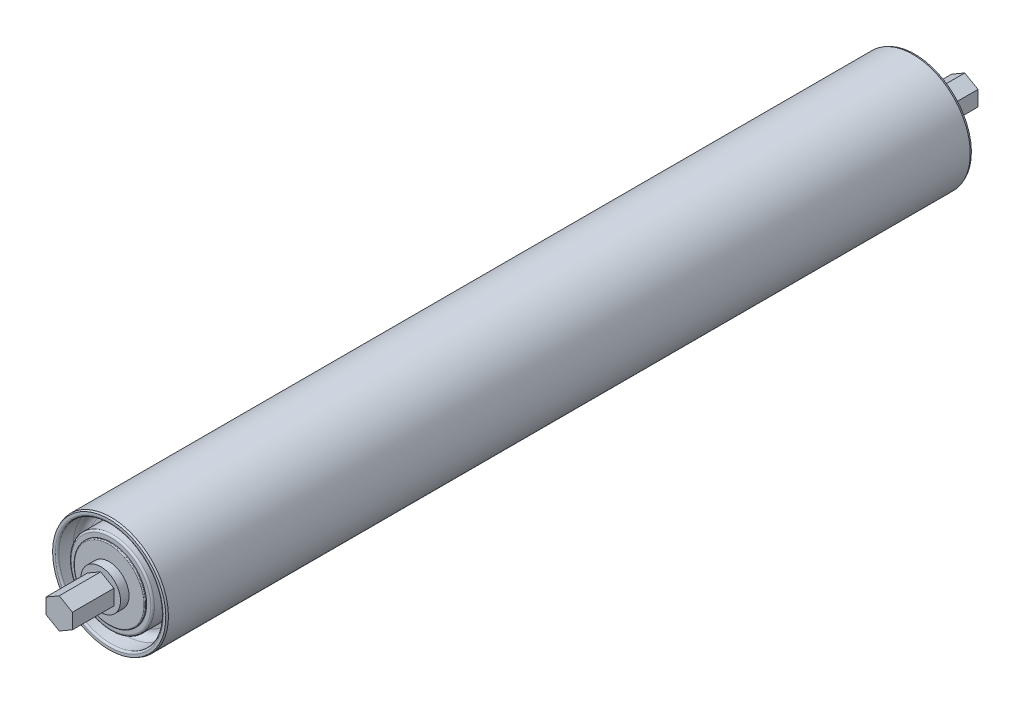
ISO-10303-21;
HEADER;
FILE_DESCRIPTION(('STEP AP214'),'2;1');
FILE_NAME('part.step','',(''),(''),'','','');
FILE_SCHEMA(('AUTOMOTIVE_DESIGN { 1 0 10303 214 1 1 1 1 }'));
ENDSEC;
DATA;
#1=APPLICATION_CONTEXT('core data for automotive mechanical design processes');
#2=APPLICATION_PROTOCOL_DEFINITION('international standard','automotive_design',2000,#1);
#3=PRODUCT_CONTEXT('',#1,'mechanical');
#4=PRODUCT('Part','Part','',(#3));
#5=PRODUCT_RELATED_PRODUCT_CATEGORY('part','',(#4));
#6=PRODUCT_DEFINITION_FORMATION('','',#4);
#7=PRODUCT_DEFINITION_CONTEXT('part definition',#1,'design');
#8=PRODUCT_DEFINITION('design','',#6,#7);
#9=PRODUCT_DEFINITION_SHAPE('','',#8);
#10=(LENGTH_UNIT() NAMED_UNIT(*) SI_UNIT(.MILLI.,.METRE.));
#11=(NAMED_UNIT(*) PLANE_ANGLE_UNIT() SI_UNIT($,.RADIAN.));
#12=(NAMED_UNIT(*) SI_UNIT($,.STERADIAN.) SOLID_ANGLE_UNIT());
#13=UNCERTAINTY_MEASURE_WITH_UNIT(LENGTH_MEASURE(1.E-05),#10,'distance_accuracy_value','');
#14=(GEOMETRIC_REPRESENTATION_CONTEXT(3) GLOBAL_UNCERTAINTY_ASSIGNED_CONTEXT((#13)) GLOBAL_UNIT_ASSIGNED_CONTEXT((#10,
#11,#12)) REPRESENTATION_CONTEXT('',''));
#15=CARTESIAN_POINT('',(0.,0.,0.));
#16=DIRECTION('',(0.,0.,1.));
#17=DIRECTION('',(1.,0.,0.));
#18=AXIS2_PLACEMENT_3D('',#15,#16,#17);
#19=CARTESIAN_POINT('',(0.,23.8125,-169.465625));
#20=DIRECTION('',(0.,0.,1.));
#21=DIRECTION('',(0.,-1.,0.));
#22=AXIS2_PLACEMENT_3D('',#19,#20,#21);
#23=PLANE('',#22);
#24=CARTESIAN_POINT('',(0.,0.,-169.465625));
#25=DIRECTION('',(0.,0.,1.));
#26=DIRECTION('',(0.,-1.,0.));
#27=AXIS2_PLACEMENT_3D('',#24,#25,#26);
#28=CIRCLE('',#27,22.733);
#29=CARTESIAN_POINT('',(0.,-22.733,-169.465625));
#30=VERTEX_POINT('',#29);
#31=EDGE_CURVE('E296',#30,#30,#28,.T.);
#32=ORIENTED_EDGE('',*,*,#31,.T.);
#33=EDGE_LOOP('',(#32));
#34=FACE_BOUND('',#33,.T.);
#35=CARTESIAN_POINT('',(0.,0.,-169.465625));
#36=DIRECTION('',(0.,0.,1.));
#37=DIRECTION('',(0.,-1.,0.));
#38=AXIS2_PLACEMENT_3D('',#35,#36,#37);
#39=CIRCLE('',#38,23.8125);
#40=CARTESIAN_POINT('',(0.,-23.8125,-169.465625));
#41=VERTEX_POINT('',#40);
#42=EDGE_CURVE('E214',#41,#41,#39,.T.);
#43=ORIENTED_EDGE('',*,*,#42,.F.);
#44=EDGE_LOOP('',(#43));
#45=FACE_BOUND('',#44,.T.);
#46=ADVANCED_FACE('F32',(#34,#45),#23,.F.);
#47=CARTESIAN_POINT('',(0.,0.,-169.465625));
#48=DIRECTION('',(0.,0.,1.));
#49=DIRECTION('',(0.,-1.,0.));
#50=AXIS2_PLACEMENT_3D('',#47,#48,#49);
#51=CONICAL_SURFACE('',#50,23.8125,0.380506377112371);
#52=CARTESIAN_POINT('',(0.,0.,-168.671875));
#53=DIRECTION('',(0.,0.,1.));
#54=DIRECTION('',(0.,-1.,0.));
#55=AXIS2_PLACEMENT_3D('',#52,#53,#54);
#56=CIRCLE('',#55,24.13);
#57=CARTESIAN_POINT('',(0.,-24.1299999999999,-168.671875));
#58=VERTEX_POINT('',#57);
#59=EDGE_CURVE('E211',#58,#58,#56,.T.);
#60=ORIENTED_EDGE('',*,*,#59,.F.);
#61=EDGE_LOOP('',(#60));
#62=FACE_BOUND('',#61,.T.);
#63=ORIENTED_EDGE('',*,*,#42,.T.);
#64=EDGE_LOOP('',(#63));
#65=FACE_BOUND('',#64,.T.);
#66=ADVANCED_FACE('F382',(#62,#65),#51,.T.);
#67=CARTESIAN_POINT('',(0.,0.,190.5));
#68=DIRECTION('',(0.,0.,1.));
#69=DIRECTION('',(0.,-1.,0.));
#70=AXIS2_PLACEMENT_3D('',#67,#68,#69);
#71=CYLINDRICAL_SURFACE('',#70,24.13);
#72=CARTESIAN_POINT('',(0.,0.,168.671875));
#73=DIRECTION('',(0.,0.,1.));
#74=DIRECTION('',(0.,-1.,0.));
#75=AXIS2_PLACEMENT_3D('',#72,#73,#74);
#76=CIRCLE('',#75,24.13);
#77=CARTESIAN_POINT('',(0.,-24.13,168.671875));
#78=VERTEX_POINT('',#77);
#79=EDGE_CURVE('E208',#78,#78,#76,.T.);
#80=ORIENTED_EDGE('',*,*,#79,.F.);
#81=EDGE_LOOP('',(#80));
#82=FACE_BOUND('',#81,.T.);
#83=ORIENTED_EDGE('',*,*,#59,.T.);
#84=EDGE_LOOP('',(#83));
#85=FACE_BOUND('',#84,.T.);
#86=ADVANCED_FACE('F387',(#82,#85),#71,.T.);
#87=CARTESIAN_POINT('',(0.,0.,168.671875));
#88=DIRECTION('',(0.,0.,-1.));
#89=DIRECTION('',(0.,1.,0.));
#90=AXIS2_PLACEMENT_3D('',#87,#88,#89);
#91=CONICAL_SURFACE('',#90,24.13,0.380506377112359);
#92=CARTESIAN_POINT('',(0.,0.,169.465625));
#93=DIRECTION('',(0.,0.,1.));
#94=DIRECTION('',(0.,-1.,0.));
#95=AXIS2_PLACEMENT_3D('',#92,#93,#94);
#96=CIRCLE('',#95,23.8125);
#97=CARTESIAN_POINT('',(0.,-23.8125,169.465625));
#98=VERTEX_POINT('',#97);
#99=EDGE_CURVE('E205',#98,#98,#96,.T.);
#100=ORIENTED_EDGE('',*,*,#99,.F.);
#101=EDGE_LOOP('',(#100));
#102=FACE_BOUND('',#101,.T.);
#103=ORIENTED_EDGE('',*,*,#79,.T.);
#104=EDGE_LOOP('',(#103));
#105=FACE_BOUND('',#104,.T.);
#106=ADVANCED_FACE('F466',(#102,#105),#91,.T.);
#107=CARTESIAN_POINT('',(0.,23.8125,169.465625));
#108=DIRECTION('',(0.,0.,-1.));
#109=DIRECTION('',(0.,1.,0.));
#110=AXIS2_PLACEMENT_3D('',#107,#108,#109);
#111=PLANE('',#110);
#112=CARTESIAN_POINT('',(0.,0.,169.465625));
#113=DIRECTION('',(0.,0.,1.));
#114=DIRECTION('',(0.,-1.,0.));
#115=AXIS2_PLACEMENT_3D('',#112,#113,#114);
#116=CIRCLE('',#115,22.733);
#117=CARTESIAN_POINT('',(0.,-22.733,169.465625));
#118=VERTEX_POINT('',#117);
#119=EDGE_CURVE('E131',#118,#118,#116,.T.);
#120=ORIENTED_EDGE('',*,*,#119,.F.);
#121=EDGE_LOOP('',(#120));
#122=FACE_BOUND('',#121,.T.);
#123=ORIENTED_EDGE('',*,*,#99,.T.);
#124=EDGE_LOOP('',(#123));
#125=FACE_BOUND('',#124,.T.);
#126=ADVANCED_FACE('F403',(#122,#125),#111,.F.);
#127=CARTESIAN_POINT('',(0.,0.,168.703625));
#128=DIRECTION('',(0.,0.,1.));
#129=DIRECTION('',(0.,-1.,0.));
#130=AXIS2_PLACEMENT_3D('',#127,#128,#129);
#131=TOROIDAL_SURFACE('',#130,22.733,0.762000000000009);
#132=ORIENTED_EDGE('',*,*,#119,.T.);
#133=EDGE_LOOP('',(#132));
#134=FACE_BOUND('',#133,.T.);
#135=CARTESIAN_POINT('',(0.,0.,168.703625));
#136=DIRECTION('',(0.,0.,1.));
#137=DIRECTION('',(0.,-1.,0.));
#138=AXIS2_PLACEMENT_3D('',#135,#136,#137);
#139=CIRCLE('',#138,21.971);
#140=CARTESIAN_POINT('',(0.,-21.971,168.703625));
#141=VERTEX_POINT('',#140);
#142=EDGE_CURVE('E293',#141,#141,#139,.T.);
#143=ORIENTED_EDGE('',*,*,#142,.F.);
#144=EDGE_LOOP('',(#143));
#145=FACE_BOUND('',#144,.T.);
#146=ADVANCED_FACE('F436',(#134,#145),#131,.T.);
#147=CARTESIAN_POINT('',(0.,0.,169.084625));
#148=DIRECTION('',(0.,0.,1.));
#149=DIRECTION('',(0.,-1.,0.));
#150=AXIS2_PLACEMENT_3D('',#147,#148,#149);
#151=TOROIDAL_SURFACE('',#150,14.620875,0.380999999999994);
#152=CARTESIAN_POINT('',(0.,0.,169.084625));
#153=DIRECTION('',(0.,0.,1.));
#154=DIRECTION('',(0.,-1.,0.));
#155=AXIS2_PLACEMENT_3D('',#152,#153,#154);
#156=CIRCLE('',#155,15.001875);
#157=CARTESIAN_POINT('',(0.,-15.001875,169.084625));
#158=VERTEX_POINT('',#157);
#159=EDGE_CURVE('E272',#158,#158,#156,.T.);
#160=ORIENTED_EDGE('',*,*,#159,.T.);
#161=EDGE_LOOP('',(#160));
#162=FACE_BOUND('',#161,.T.);
#163=CARTESIAN_POINT('',(0.,0.,169.465625));
#164=DIRECTION('',(0.,0.,1.));
#165=DIRECTION('',(0.,-1.,0.));
#166=AXIS2_PLACEMENT_3D('',#163,#164,#165);
#167=CIRCLE('',#166,14.620875);
#168=CARTESIAN_POINT('',(0.,-14.620875,169.465625));
#169=VERTEX_POINT('',#168);
#170=EDGE_CURVE('E269',#169,#169,#167,.T.);
#171=ORIENTED_EDGE('',*,*,#170,.F.);
#172=EDGE_LOOP('',(#171));
#173=FACE_BOUND('',#172,.T.);
#174=ADVANCED_FACE('F432',(#162,#173),#151,.T.);
#175=CARTESIAN_POINT('',(0.,0.,190.5));
#176=DIRECTION('',(0.,0.,1.));
#177=DIRECTION('',(0.,-1.,0.));
#178=AXIS2_PLACEMENT_3D('',#175,#176,#177);
#179=CYLINDRICAL_SURFACE('',#178,15.001875);
#180=CARTESIAN_POINT('',(0.,0.,168.703625));
#181=DIRECTION('',(0.,0.,1.));
#182=DIRECTION('',(0.,-1.,0.));
#183=AXIS2_PLACEMENT_3D('',#180,#181,#182);
#184=CIRCLE('',#183,15.001875);
#185=CARTESIAN_POINT('',(0.,-15.001875,168.703625));
#186=VERTEX_POINT('',#185);
#187=EDGE_CURVE('E275',#186,#186,#184,.T.);
#188=ORIENTED_EDGE('',*,*,#187,.T.);
#189=EDGE_LOOP('',(#188));
#190=FACE_BOUND('',#189,.T.);
#191=ORIENTED_EDGE('',*,*,#159,.F.);
#192=EDGE_LOOP('',(#191));
#193=FACE_BOUND('',#192,.T.);
#194=ADVANCED_FACE('F428',(#190,#193),#179,.T.);
#195=CARTESIAN_POINT('',(0.,15.001875,168.703625));
#196=DIRECTION('',(0.,0.,1.));
#197=DIRECTION('',(0.,-1.,0.));
#198=AXIS2_PLACEMENT_3D('',#195,#196,#197);
#199=PLANE('',#198);
#200=CARTESIAN_POINT('',(0.,0.,168.703625));
#201=DIRECTION('',(0.,0.,1.));
#202=DIRECTION('',(0.,-1.,0.));
#203=AXIS2_PLACEMENT_3D('',#200,#201,#202);
#204=CIRCLE('',#203,16.7401875);
#205=CARTESIAN_POINT('',(0.,-16.7401875,168.703625));
#206=VERTEX_POINT('',#205);
#207=EDGE_CURVE('E278',#206,#206,#204,.T.);
#208=ORIENTED_EDGE('',*,*,#207,.T.);
#209=EDGE_LOOP('',(#208));
#210=FACE_BOUND('',#209,.T.);
#211=ORIENTED_EDGE('',*,*,#187,.F.);
#212=EDGE_LOOP('',(#211));
#213=FACE_BOUND('',#212,.T.);
#214=ADVANCED_FACE('F424',(#210,#213),#199,.T.);
#215=CARTESIAN_POINT('',(0.,0.,167.941625));
#216=DIRECTION('',(0.,0.,1.));
#217=DIRECTION('',(0.,-1.,0.));
#218=AXIS2_PLACEMENT_3D('',#215,#216,#217);
#219=TOROIDAL_SURFACE('',#218,16.7401875,0.762000000000018);
#220=CARTESIAN_POINT('',(0.,0.,167.941625));
#221=DIRECTION('',(0.,0.,1.));
#222=DIRECTION('',(0.,-1.,0.));
#223=AXIS2_PLACEMENT_3D('',#220,#221,#222);
#224=CIRCLE('',#223,17.5021875);
#225=CARTESIAN_POINT('',(0.,-17.5021875,167.941625));
#226=VERTEX_POINT('',#225);
#227=EDGE_CURVE('E281',#226,#226,#224,.T.);
#228=ORIENTED_EDGE('',*,*,#227,.T.);
#229=EDGE_LOOP('',(#228));
#230=FACE_BOUND('',#229,.T.);
#231=ORIENTED_EDGE('',*,*,#207,.F.);
#232=EDGE_LOOP('',(#231));
#233=FACE_BOUND('',#232,.T.);
#234=ADVANCED_FACE('F420',(#230,#233),#219,.T.);
#235=CARTESIAN_POINT('',(0.,0.,190.5));
#236=DIRECTION('',(0.,0.,1.));
#237=DIRECTION('',(0.,-1.,0.));
#238=AXIS2_PLACEMENT_3D('',#235,#236,#237);
#239=CYLINDRICAL_SURFACE('',#238,17.5021875);
#240=CARTESIAN_POINT('',(0.,0.,159.54375));
#241=DIRECTION('',(0.,0.,1.));
#242=DIRECTION('',(0.,-1.,0.));
#243=AXIS2_PLACEMENT_3D('',#240,#241,#242);
#244=CIRCLE('',#243,17.5021875);
#245=CARTESIAN_POINT('',(0.,-17.5021875,159.54375));
#246=VERTEX_POINT('',#245);
#247=EDGE_CURVE('E284',#246,#246,#244,.T.);
#248=ORIENTED_EDGE('',*,*,#247,.T.);
#249=EDGE_LOOP('',(#248));
#250=FACE_BOUND('',#249,.T.);
#251=ORIENTED_EDGE('',*,*,#227,.F.);
#252=EDGE_LOOP('',(#251));
#253=FACE_BOUND('',#252,.T.);
#254=ADVANCED_FACE('F416',(#250,#253),#239,.T.);
#255=CARTESIAN_POINT('',(0.,17.5021875,159.54375));
#256=DIRECTION('',(0.,0.,1.));
#257=DIRECTION('',(0.,-1.,0.));
#258=AXIS2_PLACEMENT_3D('',#255,#256,#257);
#259=PLANE('',#258);
#260=CARTESIAN_POINT('',(0.,0.,159.54375));
#261=DIRECTION('',(0.,0.,1.));
#262=DIRECTION('',(0.,-1.,0.));
#263=AXIS2_PLACEMENT_3D('',#260,#261,#262);
#264=CIRCLE('',#263,18.923);
#265=CARTESIAN_POINT('',(0.,-18.923,159.54375));
#266=VERTEX_POINT('',#265);
#267=EDGE_CURVE('E287',#266,#266,#264,.T.);
#268=ORIENTED_EDGE('',*,*,#267,.T.);
#269=EDGE_LOOP('',(#268));
#270=FACE_BOUND('',#269,.T.);
#271=ORIENTED_EDGE('',*,*,#247,.F.);
#272=EDGE_LOOP('',(#271));
#273=FACE_BOUND('',#272,.T.);
#274=ADVANCED_FACE('F412',(#270,#273),#259,.T.);
#275=CARTESIAN_POINT('',(0.,0.,162.59175));
#276=DIRECTION('',(0.,0.,1.));
#277=DIRECTION('',(0.,-1.,0.));
#278=AXIS2_PLACEMENT_3D('',#275,#276,#277);
#279=TOROIDAL_SURFACE('',#278,18.923,3.04800000000002);
#280=CARTESIAN_POINT('',(0.,0.,162.59175));
#281=DIRECTION('',(0.,0.,1.));
#282=DIRECTION('',(0.,-1.,0.));
#283=AXIS2_PLACEMENT_3D('',#280,#281,#282);
#284=CIRCLE('',#283,21.971);
#285=CARTESIAN_POINT('',(0.,-21.971,162.59175));
#286=VERTEX_POINT('',#285);
#287=EDGE_CURVE('E290',#286,#286,#284,.T.);
#288=ORIENTED_EDGE('',*,*,#287,.T.);
#289=EDGE_LOOP('',(#288));
#290=FACE_BOUND('',#289,.T.);
#291=ORIENTED_EDGE('',*,*,#267,.F.);
#292=EDGE_LOOP('',(#291));
#293=FACE_BOUND('',#292,.T.);
#294=ADVANCED_FACE('F408',(#290,#293),#279,.F.);
#295=CARTESIAN_POINT('',(0.,0.,190.5));
#296=DIRECTION('',(0.,0.,1.));
#297=DIRECTION('',(0.,-1.,0.));
#298=AXIS2_PLACEMENT_3D('',#295,#296,#297);
#299=CYLINDRICAL_SURFACE('',#298,21.971);
#300=ORIENTED_EDGE('',*,*,#142,.T.);
#301=EDGE_LOOP('',(#300));
#302=FACE_BOUND('',#301,.T.);
#303=ORIENTED_EDGE('',*,*,#287,.F.);
#304=EDGE_LOOP('',(#303));
#305=FACE_BOUND('',#304,.T.);
#306=ADVANCED_FACE('F405',(#302,#305),#299,.F.);
#307=CARTESIAN_POINT('',(0.,0.,190.5));
#308=DIRECTION('',(0.,0.,-1.));
#309=DIRECTION('',(0.,1.,0.));
#310=AXIS2_PLACEMENT_3D('',#307,#308,#309);
#311=PLANE('',#310);
#312=DIRECTION('',(0.866025403784439,0.5,0.));
#313=VECTOR('',#312,1.);
#314=CARTESIAN_POINT('',(0.,-6.41580486636974,190.5));
#315=LINE('',#314,#313);
#316=CARTESIAN_POINT('',(0.,-6.41580486636974,190.5));
#317=VERTEX_POINT('',#316);
#318=CARTESIAN_POINT('',(5.55625,-3.20790243318488,190.5));
#319=VERTEX_POINT('',#318);
#320=EDGE_CURVE('E151',#317,#319,#315,.T.);
#321=ORIENTED_EDGE('',*,*,#320,.T.);
#322=DIRECTION('',(0.,1.,0.));
#323=VECTOR('',#322,1.);
#324=CARTESIAN_POINT('',(5.55625,-3.20790243318488,190.5));
#325=LINE('',#324,#323);
#326=CARTESIAN_POINT('',(5.55625,3.20790243318484,190.5));
#327=VERTEX_POINT('',#326);
#328=EDGE_CURVE('E127',#319,#327,#325,.T.);
#329=ORIENTED_EDGE('',*,*,#328,.T.);
#330=DIRECTION('',(-0.866025403784439,0.5,0.));
#331=VECTOR('',#330,1.);
#332=CARTESIAN_POINT('',(5.55625,3.20790243318484,190.5));
#333=LINE('',#332,#331);
#334=CARTESIAN_POINT('',(0.,6.41580486636969,190.5));
#335=VERTEX_POINT('',#334);
#336=EDGE_CURVE('E120',#327,#335,#333,.T.);
#337=ORIENTED_EDGE('',*,*,#336,.T.);
#338=DIRECTION('',(-0.866025403784439,-0.5,0.));
#339=VECTOR('',#338,1.);
#340=CARTESIAN_POINT('',(0.,6.41580486636969,190.5));
#341=LINE('',#340,#339);
#342=CARTESIAN_POINT('',(-5.55625,3.20790243318483,190.5));
#343=VERTEX_POINT('',#342);
#344=EDGE_CURVE('E124',#335,#343,#341,.T.);
#345=ORIENTED_EDGE('',*,*,#344,.T.);
#346=DIRECTION('',(0.,-1.,0.));
#347=VECTOR('',#346,1.);
#348=CARTESIAN_POINT('',(-5.55625,3.20790243318483,190.5));
#349=LINE('',#348,#347);
#350=CARTESIAN_POINT('',(-5.55625,-3.20790243318488,190.5));
#351=VERTEX_POINT('',#350);
#352=EDGE_CURVE('E144',#343,#351,#349,.T.);
#353=ORIENTED_EDGE('',*,*,#352,.T.);
#354=DIRECTION('',(0.866025403784439,-0.5,0.));
#355=VECTOR('',#354,1.);
#356=CARTESIAN_POINT('',(-5.55625,-3.20790243318488,190.5));
#357=LINE('',#356,#355);
#358=EDGE_CURVE('E146',#351,#317,#357,.T.);
#359=ORIENTED_EDGE('',*,*,#358,.T.);
#360=EDGE_LOOP('',(#321,#329,#337,#345,#353,#359));
#361=FACE_BOUND('',#360,.T.);
#362=ADVANCED_FACE('F122',(#361),#311,.F.);
#363=CARTESIAN_POINT('',(-5.55625,3.20790243318483,-207.474624136732));
#364=DIRECTION('',(-1.,0.,0.));
#365=DIRECTION('',(0.,-1.,0.));
#366=AXIS2_PLACEMENT_3D('',#363,#364,#365);
#367=PLANE('',#366);
#368=DIRECTION('',(0.,1.,0.));
#369=VECTOR('',#368,1.);
#370=CARTESIAN_POINT('',(-5.55625,8.334375,173.0375));
#371=LINE('',#370,#369);
#372=CARTESIAN_POINT('',(-5.55625,-3.20790243318488,173.0375));
#373=VERTEX_POINT('',#372);
#374=CARTESIAN_POINT('',(-5.55625,3.20790243318483,173.0375));
#375=VERTEX_POINT('',#374);
#376=EDGE_CURVE('E180',#373,#375,#371,.T.);
#377=ORIENTED_EDGE('',*,*,#376,.F.);
#378=DIRECTION('',(0.,0.,1.));
#379=VECTOR('',#378,1.);
#380=CARTESIAN_POINT('',(-5.55625,-3.20790243318488,-207.474624136732));
#381=LINE('',#380,#379);
#382=EDGE_CURVE('E170',#373,#351,#381,.T.);
#383=ORIENTED_EDGE('',*,*,#382,.T.);
#384=ORIENTED_EDGE('',*,*,#352,.F.);
#385=DIRECTION('',(0.,0.,1.));
#386=VECTOR('',#385,1.);
#387=CARTESIAN_POINT('',(-5.55625,3.20790243318483,-207.474624136732));
#388=LINE('',#387,#386);
#389=EDGE_CURVE('E142',#375,#343,#388,.T.);
#390=ORIENTED_EDGE('',*,*,#389,.F.);
#391=EDGE_LOOP('',(#377,#383,#384,#390));
#392=FACE_BOUND('',#391,.T.);
#393=ADVANCED_FACE('F452',(#392),#367,.T.);
#394=CARTESIAN_POINT('',(-5.55625,-3.20790243318488,-207.474624136732));
#395=DIRECTION('',(-0.5,-0.866025403784439,0.));
#396=DIRECTION('',(0.866025403784439,-0.5,0.));
#397=AXIS2_PLACEMENT_3D('',#394,#395,#396);
#398=PLANE('',#397);
#399=DIRECTION('',(-0.866025403784439,0.5,0.));
#400=VECTOR('',#399,1.);
#401=CARTESIAN_POINT('',(-6.38701523733297,-2.72825989977731,173.0375));
#402=LINE('',#401,#400);
#403=CARTESIAN_POINT('',(0.,-6.41580486636974,173.0375));
#404=VERTEX_POINT('',#403);
#405=EDGE_CURVE('E184',#404,#373,#402,.T.);
#406=ORIENTED_EDGE('',*,*,#405,.F.);
#407=DIRECTION('',(0.,0.,1.));
#408=VECTOR('',#407,1.);
#409=CARTESIAN_POINT('',(0.,-6.41580486636974,-207.474624136732));
#410=LINE('',#409,#408);
#411=EDGE_CURVE('E166',#404,#317,#410,.T.);
#412=ORIENTED_EDGE('',*,*,#411,.T.);
#413=ORIENTED_EDGE('',*,*,#358,.F.);
#414=ORIENTED_EDGE('',*,*,#382,.F.);
#415=EDGE_LOOP('',(#406,#412,#413,#414));
#416=FACE_BOUND('',#415,.T.);
#417=ADVANCED_FACE('F449',(#416),#398,.T.);
#418=CARTESIAN_POINT('',(0.,-6.41580486636974,-207.474624136732));
#419=DIRECTION('',(0.5,-0.866025403784439,0.));
#420=DIRECTION('',(0.866025403784439,0.5,0.));
#421=AXIS2_PLACEMENT_3D('',#418,#419,#420);
#422=PLANE('',#421);
#423=DIRECTION('',(-0.866025403784439,-0.5,0.));
#424=VECTOR('',#423,1.);
#425=CARTESIAN_POINT('',(6.38701523733298,-2.72825989977731,173.0375));
#426=LINE('',#425,#424);
#427=CARTESIAN_POINT('',(5.55625,-3.20790243318488,173.0375));
#428=VERTEX_POINT('',#427);
#429=EDGE_CURVE('E188',#428,#404,#426,.T.);
#430=ORIENTED_EDGE('',*,*,#429,.F.);
#431=DIRECTION('',(0.,0.,1.));
#432=VECTOR('',#431,1.);
#433=CARTESIAN_POINT('',(5.55625,-3.20790243318488,-207.474624136732));
#434=LINE('',#433,#432);
#435=EDGE_CURVE('E162',#428,#319,#434,.T.);
#436=ORIENTED_EDGE('',*,*,#435,.T.);
#437=ORIENTED_EDGE('',*,*,#320,.F.);
#438=ORIENTED_EDGE('',*,*,#411,.F.);
#439=EDGE_LOOP('',(#430,#436,#437,#438));
#440=FACE_BOUND('',#439,.T.);
#441=ADVANCED_FACE('F446',(#440),#422,.T.);
#442=CARTESIAN_POINT('',(5.55625,-3.20790243318488,-207.474624136732));
#443=DIRECTION('',(1.,0.,0.));
#444=DIRECTION('',(0.,1.,0.));
#445=AXIS2_PLACEMENT_3D('',#442,#443,#444);
#446=PLANE('',#445);
#447=DIRECTION('',(0.,-1.,0.));
#448=VECTOR('',#447,1.);
#449=CARTESIAN_POINT('',(5.55624999999999,8.334375,173.0375));
#450=LINE('',#449,#448);
#451=CARTESIAN_POINT('',(5.55625,3.20790243318484,173.0375));
#452=VERTEX_POINT('',#451);
#453=EDGE_CURVE('E192',#452,#428,#450,.T.);
#454=ORIENTED_EDGE('',*,*,#453,.F.);
#455=DIRECTION('',(0.,0.,1.));
#456=VECTOR('',#455,1.);
#457=CARTESIAN_POINT('',(5.55625,3.20790243318484,-207.474624136732));
#458=LINE('',#457,#456);
#459=EDGE_CURVE('E158',#452,#327,#458,.T.);
#460=ORIENTED_EDGE('',*,*,#459,.T.);
#461=ORIENTED_EDGE('',*,*,#328,.F.);
#462=ORIENTED_EDGE('',*,*,#435,.F.);
#463=EDGE_LOOP('',(#454,#460,#461,#462));
#464=FACE_BOUND('',#463,.T.);
#465=ADVANCED_FACE('F443',(#464),#446,.T.);
#466=CARTESIAN_POINT('',(5.55625,3.20790243318484,-207.474624136732));
#467=DIRECTION('',(0.5,0.866025403784439,0.));
#468=DIRECTION('',(-0.866025403784439,0.5,0.));
#469=AXIS2_PLACEMENT_3D('',#466,#467,#468);
#470=PLANE('',#469);
#471=DIRECTION('',(0.866025403784439,-0.5,0.));
#472=VECTOR('',#471,1.);
#473=CARTESIAN_POINT('',(-0.830765237332976,6.89544739977727,173.0375));
#474=LINE('',#473,#472);
#475=CARTESIAN_POINT('',(0.,6.41580486636969,173.0375));
#476=VERTEX_POINT('',#475);
#477=EDGE_CURVE('E136',#476,#452,#474,.T.);
#478=ORIENTED_EDGE('',*,*,#477,.F.);
#479=DIRECTION('',(0.,0.,1.));
#480=VECTOR('',#479,1.);
#481=CARTESIAN_POINT('',(0.,6.41580486636969,-207.474624136732));
#482=LINE('',#481,#480);
#483=EDGE_CURVE('E134',#476,#335,#482,.T.);
#484=ORIENTED_EDGE('',*,*,#483,.T.);
#485=ORIENTED_EDGE('',*,*,#336,.F.);
#486=ORIENTED_EDGE('',*,*,#459,.F.);
#487=EDGE_LOOP('',(#478,#484,#485,#486));
#488=FACE_BOUND('',#487,.T.);
#489=ADVANCED_FACE('F135',(#488),#470,.T.);
#490=CARTESIAN_POINT('',(0.,6.41580486636969,-207.474624136732));
#491=DIRECTION('',(-0.5,0.866025403784439,0.));
#492=DIRECTION('',(-0.866025403784439,-0.5,0.));
#493=AXIS2_PLACEMENT_3D('',#490,#491,#492);
#494=PLANE('',#493);
#495=DIRECTION('',(0.866025403784439,0.5,0.));
#496=VECTOR('',#495,1.);
#497=CARTESIAN_POINT('',(0.830765237332976,6.89544739977727,173.0375));
#498=LINE('',#497,#496);
#499=EDGE_CURVE('E55',#375,#476,#498,.T.);
#500=ORIENTED_EDGE('',*,*,#499,.F.);
#501=ORIENTED_EDGE('',*,*,#389,.T.);
#502=ORIENTED_EDGE('',*,*,#344,.F.);
#503=ORIENTED_EDGE('',*,*,#483,.F.);
#504=EDGE_LOOP('',(#500,#501,#502,#503));
#505=FACE_BOUND('',#504,.T.);
#506=ADVANCED_FACE('F140',(#505),#494,.T.);
#507=CARTESIAN_POINT('',(0.,8.334375,173.0375));
#508=DIRECTION('',(0.,0.,-1.));
#509=DIRECTION('',(0.,1.,0.));
#510=AXIS2_PLACEMENT_3D('',#507,#508,#509);
#511=PLANE('',#510);
#512=ORIENTED_EDGE('',*,*,#499,.T.);
#513=ORIENTED_EDGE('',*,*,#477,.T.);
#514=ORIENTED_EDGE('',*,*,#453,.T.);
#515=ORIENTED_EDGE('',*,*,#429,.T.);
#516=ORIENTED_EDGE('',*,*,#405,.T.);
#517=ORIENTED_EDGE('',*,*,#376,.T.);
#518=EDGE_LOOP('',(#512,#513,#514,#515,#516,#517));
#519=FACE_BOUND('',#518,.T.);
#520=CARTESIAN_POINT('',(0.,0.,173.0375));
#521=DIRECTION('',(0.,0.,1.));
#522=DIRECTION('',(0.,-1.,0.));
#523=AXIS2_PLACEMENT_3D('',#520,#521,#522);
#524=CIRCLE('',#523,8.334375);
#525=CARTESIAN_POINT('',(0.,-8.334375,173.0375));
#526=VERTEX_POINT('',#525);
#527=EDGE_CURVE('E199',#526,#526,#524,.T.);
#528=ORIENTED_EDGE('',*,*,#527,.T.);
#529=EDGE_LOOP('',(#528));
#530=FACE_BOUND('',#529,.T.);
#531=ADVANCED_FACE('F459',(#519,#530),#511,.F.);
#532=CARTESIAN_POINT('',(0.,0.,190.5));
#533=DIRECTION('',(0.,0.,1.));
#534=DIRECTION('',(0.,-1.,0.));
#535=AXIS2_PLACEMENT_3D('',#532,#533,#534);
#536=CYLINDRICAL_SURFACE('',#535,8.334375);
#537=ORIENTED_EDGE('',*,*,#527,.F.);
#538=EDGE_LOOP('',(#537));
#539=FACE_BOUND('',#538,.T.);
#540=CARTESIAN_POINT('',(0.,0.,169.465625));
#541=DIRECTION('',(0.,0.,1.));
#542=DIRECTION('',(0.,-1.,0.));
#543=AXIS2_PLACEMENT_3D('',#540,#541,#542);
#544=CIRCLE('',#543,8.334375);
#545=CARTESIAN_POINT('',(0.,-8.334375,169.465625));
#546=VERTEX_POINT('',#545);
#547=EDGE_CURVE('E202',#546,#546,#544,.T.);
#548=ORIENTED_EDGE('',*,*,#547,.T.);
#549=EDGE_LOOP('',(#548));
#550=FACE_BOUND('',#549,.T.);
#551=ADVANCED_FACE('F400',(#539,#550),#536,.T.);
#552=ORIENTED_EDGE('',*,*,#547,.F.);
#553=EDGE_LOOP('',(#552));
#554=FACE_BOUND('',#553,.T.);
#555=ORIENTED_EDGE('',*,*,#170,.T.);
#556=EDGE_LOOP('',(#555));
#557=FACE_BOUND('',#556,.T.);
#558=ADVANCED_FACE('F395',(#554,#557),#111,.F.);
#559=CARTESIAN_POINT('',(0.,0.,-168.703625));
#560=DIRECTION('',(0.,0.,-1.));
#561=DIRECTION('',(0.,-1.,0.));
#562=AXIS2_PLACEMENT_3D('',#559,#560,#561);
#563=TOROIDAL_SURFACE('',#562,22.733,0.762000000000009);
#564=ORIENTED_EDGE('',*,*,#31,.F.);
#565=EDGE_LOOP('',(#564));
#566=FACE_BOUND('',#565,.T.);
#567=CARTESIAN_POINT('',(0.,0.,-168.703625));
#568=DIRECTION('',(0.,0.,1.));
#569=DIRECTION('',(0.,-1.,0.));
#570=AXIS2_PLACEMENT_3D('',#567,#568,#569);
#571=CIRCLE('',#570,21.971);
#572=CARTESIAN_POINT('',(0.,-21.971,-168.703625));
#573=VERTEX_POINT('',#572);
#574=EDGE_CURVE('E323',#573,#573,#571,.T.);
#575=ORIENTED_EDGE('',*,*,#574,.T.);
#576=EDGE_LOOP('',(#575));
#577=FACE_BOUND('',#576,.T.);
#578=ADVANCED_FACE('F327',(#566,#577),#563,.T.);
#579=CARTESIAN_POINT('',(0.,0.,-169.084625));
#580=DIRECTION('',(0.,0.,-1.));
#581=DIRECTION('',(0.,-1.,0.));
#582=AXIS2_PLACEMENT_3D('',#579,#580,#581);
#583=TOROIDAL_SURFACE('',#582,14.620875,0.380999999999994);
#584=CARTESIAN_POINT('',(0.,0.,-169.084625));
#585=DIRECTION('',(0.,0.,1.));
#586=DIRECTION('',(0.,-1.,0.));
#587=AXIS2_PLACEMENT_3D('',#584,#585,#586);
#588=CIRCLE('',#587,15.001875);
#589=CARTESIAN_POINT('',(0.,-15.001875,-169.084625));
#590=VERTEX_POINT('',#589);
#591=EDGE_CURVE('E302',#590,#590,#588,.T.);
#592=ORIENTED_EDGE('',*,*,#591,.F.);
#593=EDGE_LOOP('',(#592));
#594=FACE_BOUND('',#593,.T.);
#595=CARTESIAN_POINT('',(0.,0.,-169.465625));
#596=DIRECTION('',(0.,0.,1.));
#597=DIRECTION('',(0.,-1.,0.));
#598=AXIS2_PLACEMENT_3D('',#595,#596,#597);
#599=CIRCLE('',#598,14.620875);
#600=CARTESIAN_POINT('',(0.,-14.620875,-169.465625));
#601=VERTEX_POINT('',#600);
#602=EDGE_CURVE('E299',#601,#601,#599,.T.);
#603=ORIENTED_EDGE('',*,*,#602,.T.);
#604=EDGE_LOOP('',(#603));
#605=FACE_BOUND('',#604,.T.);
#606=ADVANCED_FACE('F368',(#594,#605),#583,.T.);
#607=CARTESIAN_POINT('',(0.,0.,-190.5));
#608=DIRECTION('',(0.,0.,-1.));
#609=DIRECTION('',(0.,-1.,0.));
#610=AXIS2_PLACEMENT_3D('',#607,#608,#609);
#611=CYLINDRICAL_SURFACE('',#610,15.001875);
#612=CARTESIAN_POINT('',(0.,0.,-168.703625));
#613=DIRECTION('',(0.,0.,1.));
#614=DIRECTION('',(0.,-1.,0.));
#615=AXIS2_PLACEMENT_3D('',#612,#613,#614);
#616=CIRCLE('',#615,15.001875);
#617=CARTESIAN_POINT('',(0.,-15.001875,-168.703625));
#618=VERTEX_POINT('',#617);
#619=EDGE_CURVE('E305',#618,#618,#616,.T.);
#620=ORIENTED_EDGE('',*,*,#619,.F.);
#621=EDGE_LOOP('',(#620));
#622=FACE_BOUND('',#621,.T.);
#623=ORIENTED_EDGE('',*,*,#591,.T.);
#624=EDGE_LOOP('',(#623));
#625=FACE_BOUND('',#624,.T.);
#626=ADVANCED_FACE('F362',(#622,#625),#611,.T.);
#627=CARTESIAN_POINT('',(0.,15.001875,-168.703625));
#628=DIRECTION('',(0.,0.,-1.));
#629=DIRECTION('',(0.,-1.,0.));
#630=AXIS2_PLACEMENT_3D('',#627,#628,#629);
#631=PLANE('',#630);
#632=CARTESIAN_POINT('',(0.,0.,-168.703625));
#633=DIRECTION('',(0.,0.,1.));
#634=DIRECTION('',(0.,-1.,0.));
#635=AXIS2_PLACEMENT_3D('',#632,#633,#634);
#636=CIRCLE('',#635,16.7401875);
#637=CARTESIAN_POINT('',(0.,-16.7401875,-168.703625));
#638=VERTEX_POINT('',#637);
#639=EDGE_CURVE('E308',#638,#638,#636,.T.);
#640=ORIENTED_EDGE('',*,*,#639,.F.);
#641=EDGE_LOOP('',(#640));
#642=FACE_BOUND('',#641,.T.);
#643=ORIENTED_EDGE('',*,*,#619,.T.);
#644=EDGE_LOOP('',(#643));
#645=FACE_BOUND('',#644,.T.);
#646=ADVANCED_FACE('F356',(#642,#645),#631,.T.);
#647=CARTESIAN_POINT('',(0.,0.,-167.941625));
#648=DIRECTION('',(0.,0.,-1.));
#649=DIRECTION('',(0.,-1.,0.));
#650=AXIS2_PLACEMENT_3D('',#647,#648,#649);
#651=TOROIDAL_SURFACE('',#650,16.7401875,0.762000000000018);
#652=CARTESIAN_POINT('',(0.,0.,-167.941625));
#653=DIRECTION('',(0.,0.,1.));
#654=DIRECTION('',(0.,-1.,0.));
#655=AXIS2_PLACEMENT_3D('',#652,#653,#654);
#656=CIRCLE('',#655,17.5021875);
#657=CARTESIAN_POINT('',(0.,-17.5021875,-167.941625));
#658=VERTEX_POINT('',#657);
#659=EDGE_CURVE('E311',#658,#658,#656,.T.);
#660=ORIENTED_EDGE('',*,*,#659,.F.);
#661=EDGE_LOOP('',(#660));
#662=FACE_BOUND('',#661,.T.);
#663=ORIENTED_EDGE('',*,*,#639,.T.);
#664=EDGE_LOOP('',(#663));
#665=FACE_BOUND('',#664,.T.);
#666=ADVANCED_FACE('F350',(#662,#665),#651,.T.);
#667=CARTESIAN_POINT('',(0.,0.,-190.5));
#668=DIRECTION('',(0.,0.,-1.));
#669=DIRECTION('',(0.,-1.,0.));
#670=AXIS2_PLACEMENT_3D('',#667,#668,#669);
#671=CYLINDRICAL_SURFACE('',#670,17.5021875);
#672=CARTESIAN_POINT('',(0.,0.,-159.54375));
#673=DIRECTION('',(0.,0.,1.));
#674=DIRECTION('',(0.,-1.,0.));
#675=AXIS2_PLACEMENT_3D('',#672,#673,#674);
#676=CIRCLE('',#675,17.5021875);
#677=CARTESIAN_POINT('',(0.,-17.5021875,-159.54375));
#678=VERTEX_POINT('',#677);
#679=EDGE_CURVE('E314',#678,#678,#676,.T.);
#680=ORIENTED_EDGE('',*,*,#679,.F.);
#681=EDGE_LOOP('',(#680));
#682=FACE_BOUND('',#681,.T.);
#683=ORIENTED_EDGE('',*,*,#659,.T.);
#684=EDGE_LOOP('',(#683));
#685=FACE_BOUND('',#684,.T.);
#686=ADVANCED_FACE('F344',(#682,#685),#671,.T.);
#687=CARTESIAN_POINT('',(0.,17.5021875,-159.54375));
#688=DIRECTION('',(0.,0.,-1.));
#689=DIRECTION('',(0.,-1.,0.));
#690=AXIS2_PLACEMENT_3D('',#687,#688,#689);
#691=PLANE('',#690);
#692=CARTESIAN_POINT('',(0.,0.,-159.54375));
#693=DIRECTION('',(0.,0.,1.));
#694=DIRECTION('',(0.,-1.,0.));
#695=AXIS2_PLACEMENT_3D('',#692,#693,#694);
#696=CIRCLE('',#695,18.923);
#697=CARTESIAN_POINT('',(0.,-18.923,-159.54375));
#698=VERTEX_POINT('',#697);
#699=EDGE_CURVE('E317',#698,#698,#696,.T.);
#700=ORIENTED_EDGE('',*,*,#699,.F.);
#701=EDGE_LOOP('',(#700));
#702=FACE_BOUND('',#701,.T.);
#703=ORIENTED_EDGE('',*,*,#679,.T.);
#704=EDGE_LOOP('',(#703));
#705=FACE_BOUND('',#704,.T.);
#706=ADVANCED_FACE('F338',(#702,#705),#691,.T.);
#707=CARTESIAN_POINT('',(0.,0.,-162.59175));
#708=DIRECTION('',(0.,0.,-1.));
#709=DIRECTION('',(0.,-1.,0.));
#710=AXIS2_PLACEMENT_3D('',#707,#708,#709);
#711=TOROIDAL_SURFACE('',#710,18.923,3.04800000000002);
#712=CARTESIAN_POINT('',(0.,0.,-162.59175));
#713=DIRECTION('',(0.,0.,1.));
#714=DIRECTION('',(0.,-1.,0.));
#715=AXIS2_PLACEMENT_3D('',#712,#713,#714);
#716=CIRCLE('',#715,21.971);
#717=CARTESIAN_POINT('',(0.,-21.971,-162.59175));
#718=VERTEX_POINT('',#717);
#719=EDGE_CURVE('E320',#718,#718,#716,.T.);
#720=ORIENTED_EDGE('',*,*,#719,.F.);
#721=EDGE_LOOP('',(#720));
#722=FACE_BOUND('',#721,.T.);
#723=ORIENTED_EDGE('',*,*,#699,.T.);
#724=EDGE_LOOP('',(#723));
#725=FACE_BOUND('',#724,.T.);
#726=ADVANCED_FACE('F332',(#722,#725),#711,.F.);
#727=CARTESIAN_POINT('',(0.,0.,-190.5));
#728=DIRECTION('',(0.,0.,-1.));
#729=DIRECTION('',(0.,-1.,0.));
#730=AXIS2_PLACEMENT_3D('',#727,#728,#729);
#731=CYLINDRICAL_SURFACE('',#730,21.971);
#732=ORIENTED_EDGE('',*,*,#574,.F.);
#733=EDGE_LOOP('',(#732));
#734=FACE_BOUND('',#733,.T.);
#735=ORIENTED_EDGE('',*,*,#719,.T.);
#736=EDGE_LOOP('',(#735));
#737=FACE_BOUND('',#736,.T.);
#738=ADVANCED_FACE('F329',(#734,#737),#731,.F.);
#739=CARTESIAN_POINT('',(0.,0.,-190.5));
#740=DIRECTION('',(0.,0.,1.));
#741=DIRECTION('',(0.,-1.,0.));
#742=AXIS2_PLACEMENT_3D('',#739,#740,#741);
#743=PLANE('',#742);
#744=DIRECTION('',(0.866025403784439,-0.5,0.));
#745=VECTOR('',#744,1.);
#746=CARTESIAN_POINT('',(5.55625,3.20790243318484,-190.5));
#747=LINE('',#746,#745);
#748=CARTESIAN_POINT('',(0.,6.41580486636969,-190.5));
#749=VERTEX_POINT('',#748);
#750=CARTESIAN_POINT('',(5.55625,3.20790243318484,-190.5));
#751=VERTEX_POINT('',#750);
#752=EDGE_CURVE('E177',#749,#751,#747,.T.);
#753=ORIENTED_EDGE('',*,*,#752,.T.);
#754=DIRECTION('',(0.,-1.,0.));
#755=VECTOR('',#754,1.);
#756=CARTESIAN_POINT('',(5.55625,-3.20790243318489,-190.5));
#757=LINE('',#756,#755);
#758=CARTESIAN_POINT('',(5.55625,-3.20790243318489,-190.5));
#759=VERTEX_POINT('',#758);
#760=EDGE_CURVE('E250',#751,#759,#757,.T.);
#761=ORIENTED_EDGE('',*,*,#760,.T.);
#762=DIRECTION('',(-0.866025403784439,-0.5,0.));
#763=VECTOR('',#762,1.);
#764=CARTESIAN_POINT('',(0.,-6.41580486636974,-190.5));
#765=LINE('',#764,#763);
#766=CARTESIAN_POINT('',(0.,-6.41580486636974,-190.5));
#767=VERTEX_POINT('',#766);
#768=EDGE_CURVE('E247',#759,#767,#765,.T.);
#769=ORIENTED_EDGE('',*,*,#768,.T.);
#770=DIRECTION('',(-0.866025403784439,0.5,0.));
#771=VECTOR('',#770,1.);
#772=CARTESIAN_POINT('',(-5.55625,-3.20790243318488,-190.5));
#773=LINE('',#772,#771);
#774=CARTESIAN_POINT('',(-5.55625,-3.20790243318488,-190.5));
#775=VERTEX_POINT('',#774);
#776=EDGE_CURVE('E243',#767,#775,#773,.T.);
#777=ORIENTED_EDGE('',*,*,#776,.T.);
#778=DIRECTION('',(0.,1.,0.));
#779=VECTOR('',#778,1.);
#780=CARTESIAN_POINT('',(-5.55625,3.20790243318483,-190.5));
#781=LINE('',#780,#779);
#782=CARTESIAN_POINT('',(-5.55625,3.20790243318483,-190.5));
#783=VERTEX_POINT('',#782);
#784=EDGE_CURVE('E157',#775,#783,#781,.T.);
#785=ORIENTED_EDGE('',*,*,#784,.T.);
#786=DIRECTION('',(0.866025403784439,0.5,0.));
#787=VECTOR('',#786,1.);
#788=CARTESIAN_POINT('',(0.,6.41580486636969,-190.5));
#789=LINE('',#788,#787);
#790=EDGE_CURVE('E174',#783,#749,#789,.T.);
#791=ORIENTED_EDGE('',*,*,#790,.T.);
#792=EDGE_LOOP('',(#753,#761,#769,#777,#785,#791));
#793=FACE_BOUND('',#792,.T.);
#794=ADVANCED_FACE('F34',(#793),#743,.F.);
#795=CARTESIAN_POINT('',(-5.55625,-3.20790243318488,-173.0375));
#796=VERTEX_POINT('',#795);
#797=EDGE_CURVE('E167',#775,#796,#381,.T.);
#798=ORIENTED_EDGE('',*,*,#797,.T.);
#799=DIRECTION('',(0.,-1.,0.));
#800=VECTOR('',#799,1.);
#801=CARTESIAN_POINT('',(-5.55625,8.33437500000004,-173.0375));
#802=LINE('',#801,#800);
#803=CARTESIAN_POINT('',(-5.55625,3.20790243318483,-173.0375));
#804=VERTEX_POINT('',#803);
#805=EDGE_CURVE('E182',#804,#796,#802,.T.);
#806=ORIENTED_EDGE('',*,*,#805,.F.);
#807=EDGE_CURVE('E171',#783,#804,#388,.T.);
#808=ORIENTED_EDGE('',*,*,#807,.F.);
#809=ORIENTED_EDGE('',*,*,#784,.F.);
#810=EDGE_LOOP('',(#798,#806,#808,#809));
#811=FACE_BOUND('',#810,.T.);
#812=ADVANCED_FACE('F265',(#811),#367,.T.);
#813=ORIENTED_EDGE('',*,*,#807,.T.);
#814=DIRECTION('',(-0.866025403784439,-0.5,0.));
#815=VECTOR('',#814,1.);
#816=CARTESIAN_POINT('',(0.830765237332994,6.89544739977728,-173.0375));
#817=LINE('',#816,#815);
#818=CARTESIAN_POINT('',(0.,6.41580486636969,-173.0375));
#819=VERTEX_POINT('',#818);
#820=EDGE_CURVE('E47',#819,#804,#817,.T.);
#821=ORIENTED_EDGE('',*,*,#820,.F.);
#822=EDGE_CURVE('E138',#749,#819,#482,.T.);
#823=ORIENTED_EDGE('',*,*,#822,.F.);
#824=ORIENTED_EDGE('',*,*,#790,.F.);
#825=EDGE_LOOP('',(#813,#821,#823,#824));
#826=FACE_BOUND('',#825,.T.);
#827=ADVANCED_FACE('F262',(#826),#494,.T.);
#828=ORIENTED_EDGE('',*,*,#822,.T.);
#829=DIRECTION('',(-0.866025403784439,0.5,0.));
#830=VECTOR('',#829,1.);
#831=CARTESIAN_POINT('',(-0.830765237332994,6.89544739977728,-173.0375));
#832=LINE('',#831,#830);
#833=CARTESIAN_POINT('',(5.55625,3.20790243318484,-173.0375));
#834=VERTEX_POINT('',#833);
#835=EDGE_CURVE('E197',#834,#819,#832,.T.);
#836=ORIENTED_EDGE('',*,*,#835,.F.);
#837=EDGE_CURVE('E154',#751,#834,#458,.T.);
#838=ORIENTED_EDGE('',*,*,#837,.F.);
#839=ORIENTED_EDGE('',*,*,#752,.F.);
#840=EDGE_LOOP('',(#828,#836,#838,#839));
#841=FACE_BOUND('',#840,.T.);
#842=ADVANCED_FACE('F258',(#841),#470,.T.);
#843=ORIENTED_EDGE('',*,*,#837,.T.);
#844=DIRECTION('',(0.,1.,0.));
#845=VECTOR('',#844,1.);
#846=CARTESIAN_POINT('',(5.55624999999999,8.33437500000004,-173.0375));
#847=LINE('',#846,#845);
#848=CARTESIAN_POINT('',(5.55625,-3.20790243318488,-173.0375));
#849=VERTEX_POINT('',#848);
#850=EDGE_CURVE('E194',#849,#834,#847,.T.);
#851=ORIENTED_EDGE('',*,*,#850,.F.);
#852=EDGE_CURVE('E159',#759,#849,#434,.T.);
#853=ORIENTED_EDGE('',*,*,#852,.F.);
#854=ORIENTED_EDGE('',*,*,#760,.F.);
#855=EDGE_LOOP('',(#843,#851,#853,#854));
#856=FACE_BOUND('',#855,.T.);
#857=ADVANCED_FACE('F260',(#856),#446,.T.);
#858=ORIENTED_EDGE('',*,*,#852,.T.);
#859=DIRECTION('',(0.866025403784439,0.5,0.));
#860=VECTOR('',#859,1.);
#861=CARTESIAN_POINT('',(6.38701523733299,-2.7282598997773,-173.0375));
#862=LINE('',#861,#860);
#863=CARTESIAN_POINT('',(0.,-6.41580486636974,-173.0375));
#864=VERTEX_POINT('',#863);
#865=EDGE_CURVE('E190',#864,#849,#862,.T.);
#866=ORIENTED_EDGE('',*,*,#865,.F.);
#867=EDGE_CURVE('E163',#767,#864,#410,.T.);
#868=ORIENTED_EDGE('',*,*,#867,.F.);
#869=ORIENTED_EDGE('',*,*,#768,.F.);
#870=EDGE_LOOP('',(#858,#866,#868,#869));
#871=FACE_BOUND('',#870,.T.);
#872=ADVANCED_FACE('F239',(#871),#422,.T.);
#873=ORIENTED_EDGE('',*,*,#867,.T.);
#874=DIRECTION('',(0.866025403784439,-0.5,0.));
#875=VECTOR('',#874,1.);
#876=CARTESIAN_POINT('',(-6.38701523733299,-2.7282598997773,-173.0375));
#877=LINE('',#876,#875);
#878=EDGE_CURVE('E186',#796,#864,#877,.T.);
#879=ORIENTED_EDGE('',*,*,#878,.F.);
#880=ORIENTED_EDGE('',*,*,#797,.F.);
#881=ORIENTED_EDGE('',*,*,#776,.F.);
#882=EDGE_LOOP('',(#873,#879,#880,#881));
#883=FACE_BOUND('',#882,.T.);
#884=ADVANCED_FACE('F230',(#883),#398,.T.);
#885=CARTESIAN_POINT('',(0.,8.33437500000004,-173.0375));
#886=DIRECTION('',(0.,0.,1.));
#887=DIRECTION('',(0.,-1.,0.));
#888=AXIS2_PLACEMENT_3D('',#885,#886,#887);
#889=PLANE('',#888);
#890=CARTESIAN_POINT('',(0.,0.,-173.0375));
#891=DIRECTION('',(0.,0.,1.));
#892=DIRECTION('',(0.,-1.,0.));
#893=AXIS2_PLACEMENT_3D('',#890,#891,#892);
#894=CIRCLE('',#893,8.334375);
#895=CARTESIAN_POINT('',(0.,-8.33437499999995,-173.0375));
#896=VERTEX_POINT('',#895);
#897=EDGE_CURVE('E11',#896,#896,#894,.T.);
#898=ORIENTED_EDGE('',*,*,#897,.F.);
#899=EDGE_LOOP('',(#898));
#900=FACE_BOUND('',#899,.T.);
#901=ORIENTED_EDGE('',*,*,#878,.T.);
#902=ORIENTED_EDGE('',*,*,#865,.T.);
#903=ORIENTED_EDGE('',*,*,#850,.T.);
#904=ORIENTED_EDGE('',*,*,#835,.T.);
#905=ORIENTED_EDGE('',*,*,#820,.T.);
#906=ORIENTED_EDGE('',*,*,#805,.T.);
#907=EDGE_LOOP('',(#901,#902,#903,#904,#905,#906));
#908=FACE_BOUND('',#907,.T.);
#909=ADVANCED_FACE('F225',(#900,#908),#889,.F.);
#910=CARTESIAN_POINT('',(0.,0.,190.5));
#911=DIRECTION('',(0.,0.,1.));
#912=DIRECTION('',(0.,-1.,0.));
#913=AXIS2_PLACEMENT_3D('',#910,#911,#912);
#914=CYLINDRICAL_SURFACE('',#913,8.334375);
#915=CARTESIAN_POINT('',(0.,0.,-169.465625));
#916=DIRECTION('',(0.,0.,1.));
#917=DIRECTION('',(0.,-1.,0.));
#918=AXIS2_PLACEMENT_3D('',#915,#916,#917);
#919=CIRCLE('',#918,8.334375);
#920=CARTESIAN_POINT('',(0.,-8.33437499999996,-169.465625));
#921=VERTEX_POINT('',#920);
#922=EDGE_CURVE('E40',#921,#921,#919,.T.);
#923=ORIENTED_EDGE('',*,*,#922,.F.);
#924=EDGE_LOOP('',(#923));
#925=FACE_BOUND('',#924,.T.);
#926=ORIENTED_EDGE('',*,*,#897,.T.);
#927=EDGE_LOOP('',(#926));
#928=FACE_BOUND('',#927,.T.);
#929=ADVANCED_FACE('F222',(#925,#928),#914,.T.);
#930=ORIENTED_EDGE('',*,*,#922,.T.);
#931=EDGE_LOOP('',(#930));
#932=FACE_BOUND('',#931,.T.);
#933=ORIENTED_EDGE('',*,*,#602,.F.);
#934=EDGE_LOOP('',(#933));
#935=FACE_BOUND('',#934,.T.);
#936=ADVANCED_FACE('F219',(#932,#935),#23,.F.);
#937=CLOSED_SHELL('',(#46,#66,#86,#106,#126,#146,#174,#194,#214,#234,#254,#274,#294,#306,#362,
#393,#417,#441,#465,#489,#506,#531,#551,#558,#578,#606,#626,#646,#666,#686,#706,#726,#738,#794,
#812,#827,#842,#857,#872,#884,#909,#929,#936));
#938=MANIFOLD_SOLID_BREP('B2',#937);
#939=ADVANCED_BREP_SHAPE_REPRESENTATION('',(#18,#938),#14);
#940=SHAPE_DEFINITION_REPRESENTATION(#9,#939);
ENDSEC;
END-ISO-10303-21;
